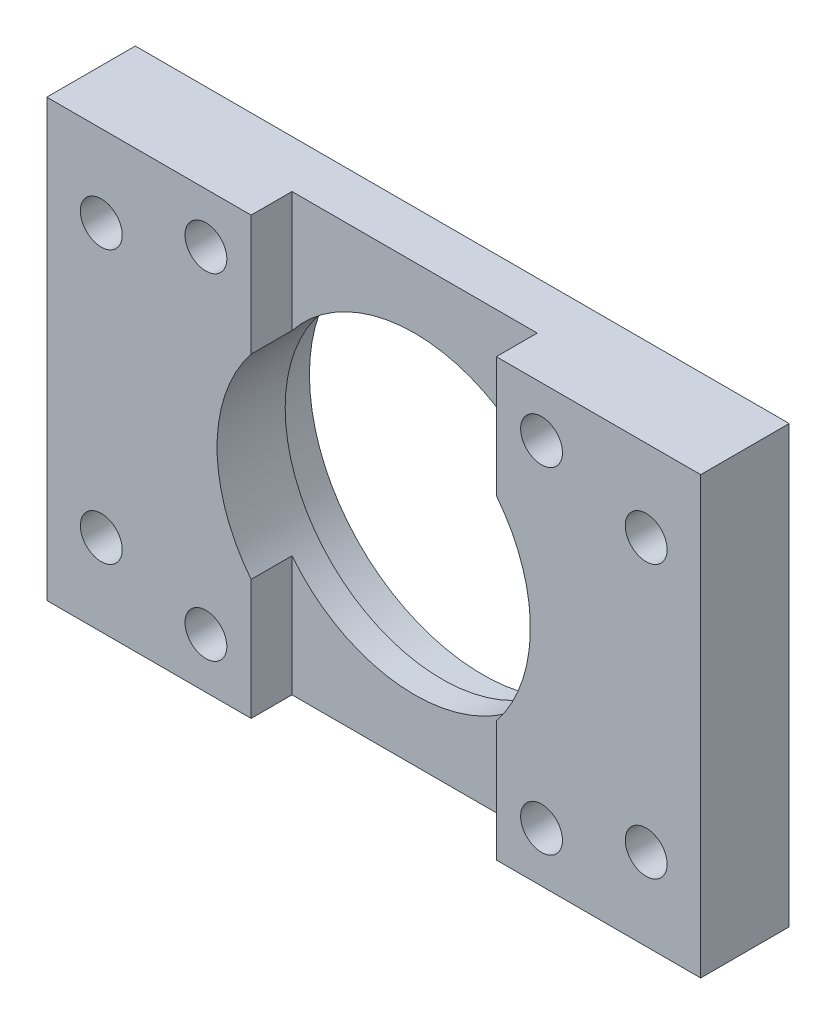
ISO-10303-21;
HEADER;
FILE_DESCRIPTION(('STEP AP214'),'2;1');
FILE_NAME('part.step','',(''),(''),'','','');
FILE_SCHEMA(('AUTOMOTIVE_DESIGN { 1 0 10303 214 1 1 1 1 }'));
ENDSEC;
DATA;
#1=APPLICATION_CONTEXT('core data for automotive mechanical design processes');
#2=APPLICATION_PROTOCOL_DEFINITION('international standard','automotive_design',2000,#1);
#3=PRODUCT_CONTEXT('',#1,'mechanical');
#4=PRODUCT('Part','Part','',(#3));
#5=PRODUCT_RELATED_PRODUCT_CATEGORY('part','',(#4));
#6=PRODUCT_DEFINITION_FORMATION('','',#4);
#7=PRODUCT_DEFINITION_CONTEXT('part definition',#1,'design');
#8=PRODUCT_DEFINITION('design','',#6,#7);
#9=PRODUCT_DEFINITION_SHAPE('','',#8);
#10=(LENGTH_UNIT() NAMED_UNIT(*) SI_UNIT(.MILLI.,.METRE.));
#11=(NAMED_UNIT(*) PLANE_ANGLE_UNIT() SI_UNIT($,.RADIAN.));
#12=(NAMED_UNIT(*) SI_UNIT($,.STERADIAN.) SOLID_ANGLE_UNIT());
#13=UNCERTAINTY_MEASURE_WITH_UNIT(LENGTH_MEASURE(1.E-05),#10,'distance_accuracy_value','');
#14=(GEOMETRIC_REPRESENTATION_CONTEXT(3) GLOBAL_UNCERTAINTY_ASSIGNED_CONTEXT((#13)) GLOBAL_UNIT_ASSIGNED_CONTEXT((#10,
#11,#12)) REPRESENTATION_CONTEXT('',''));
#15=CARTESIAN_POINT('',(0.,0.,0.));
#16=DIRECTION('',(0.,0.,1.));
#17=DIRECTION('',(1.,0.,0.));
#18=AXIS2_PLACEMENT_3D('',#15,#16,#17);
#19=CARTESIAN_POINT('',(0.,0.,0.));
#20=DIRECTION('',(0.,0.,1.));
#21=DIRECTION('',(1.,0.,0.));
#22=AXIS2_PLACEMENT_3D('',#19,#20,#21);
#23=CYLINDRICAL_SURFACE('',#22,9.128125);
#24=CARTESIAN_POINT('',(0.,0.,3.96875));
#25=DIRECTION('',(0.,0.,-1.));
#26=DIRECTION('',(-1.,0.,0.));
#27=AXIS2_PLACEMENT_3D('',#24,#25,#26);
#28=CIRCLE('',#27,9.128125);
#29=CARTESIAN_POINT('',(7.14375,5.6823852344878,3.96875));
#30=VERTEX_POINT('',#29);
#31=CARTESIAN_POINT('',(-7.14375,5.6823852344878,3.96875));
#32=VERTEX_POINT('',#31);
#33=EDGE_CURVE('E49',#30,#32,#28,.F.);
#34=ORIENTED_EDGE('',*,*,#33,.T.);
#35=DIRECTION('',(0.,0.,1.));
#36=VECTOR('',#35,1.);
#37=CARTESIAN_POINT('',(-7.14375,5.6823852344878,0.));
#38=LINE('',#37,#36);
#39=CARTESIAN_POINT('',(-7.14375,5.6823852344878,6.35));
#40=VERTEX_POINT('',#39);
#41=EDGE_CURVE('E12',#32,#40,#38,.T.);
#42=ORIENTED_EDGE('',*,*,#41,.T.);
#43=CARTESIAN_POINT('',(0.,0.,6.35));
#44=DIRECTION('',(0.,0.,1.));
#45=DIRECTION('',(1.,0.,0.));
#46=AXIS2_PLACEMENT_3D('',#43,#44,#45);
#47=CIRCLE('',#46,9.128125);
#48=CARTESIAN_POINT('',(-7.14375,-5.6823852344878,6.35));
#49=VERTEX_POINT('',#48);
#50=EDGE_CURVE('E202',#40,#49,#47,.T.);
#51=ORIENTED_EDGE('',*,*,#50,.T.);
#52=DIRECTION('',(0.,0.,1.));
#53=VECTOR('',#52,1.);
#54=CARTESIAN_POINT('',(-7.14375,-5.6823852344878,0.));
#55=LINE('',#54,#53);
#56=CARTESIAN_POINT('',(-7.14375,-5.6823852344878,3.96875));
#57=VERTEX_POINT('',#56);
#58=EDGE_CURVE('E164',#49,#57,#55,.F.);
#59=ORIENTED_EDGE('',*,*,#58,.T.);
#60=CARTESIAN_POINT('',(7.14375,-5.6823852344878,3.96875));
#61=VERTEX_POINT('',#60);
#62=EDGE_CURVE('E156',#57,#61,#28,.F.);
#63=ORIENTED_EDGE('',*,*,#62,.T.);
#64=DIRECTION('',(0.,0.,1.));
#65=VECTOR('',#64,1.);
#66=CARTESIAN_POINT('',(7.14375,-5.6823852344878,0.));
#67=LINE('',#66,#65);
#68=CARTESIAN_POINT('',(7.14375,-5.6823852344878,6.35));
#69=VERTEX_POINT('',#68);
#70=EDGE_CURVE('E152',#61,#69,#67,.T.);
#71=ORIENTED_EDGE('',*,*,#70,.T.);
#72=CARTESIAN_POINT('',(7.14375,5.6823852344878,6.35));
#73=VERTEX_POINT('',#72);
#74=EDGE_CURVE('E199',#69,#73,#47,.T.);
#75=ORIENTED_EDGE('',*,*,#74,.T.);
#76=DIRECTION('',(0.,0.,1.));
#77=VECTOR('',#76,1.);
#78=CARTESIAN_POINT('',(7.14375,5.6823852344878,0.));
#79=LINE('',#78,#77);
#80=EDGE_CURVE('E167',#73,#30,#79,.F.);
#81=ORIENTED_EDGE('',*,*,#80,.T.);
#82=EDGE_LOOP('',(#34,#42,#51,#59,#63,#71,#75,#81));
#83=FACE_BOUND('',#82,.T.);
#84=CARTESIAN_POINT('',(0.,0.,2.38125));
#85=DIRECTION('',(0.,0.,-1.));
#86=DIRECTION('',(-1.,0.,0.));
#87=AXIS2_PLACEMENT_3D('',#84,#85,#86);
#88=CIRCLE('',#87,9.128125);
#89=CARTESIAN_POINT('',(-9.128125,0.,2.38125));
#90=VERTEX_POINT('',#89);
#91=EDGE_CURVE('E44',#90,#90,#88,.F.);
#92=ORIENTED_EDGE('',*,*,#91,.F.);
#93=EDGE_LOOP('',(#92));
#94=FACE_BOUND('',#93,.T.);
#95=ADVANCED_FACE('F40',(#83,#94),#23,.F.);
#96=CARTESIAN_POINT('',(-19.05,12.7,6.35));
#97=DIRECTION('',(1.,0.,0.));
#98=DIRECTION('',(0.,0.,-1.));
#99=AXIS2_PLACEMENT_3D('',#96,#97,#98);
#100=PLANE('',#99);
#101=DIRECTION('',(0.,1.,0.));
#102=VECTOR('',#101,1.);
#103=CARTESIAN_POINT('',(-19.05,0.,1.190625));
#104=LINE('',#103,#102);
#105=CARTESIAN_POINT('',(-19.05,-12.7,1.190625));
#106=VERTEX_POINT('',#105);
#107=CARTESIAN_POINT('',(-19.05,12.7,1.190625));
#108=VERTEX_POINT('',#107);
#109=EDGE_CURVE('E56',#106,#108,#104,.T.);
#110=ORIENTED_EDGE('',*,*,#109,.F.);
#111=DIRECTION('',(0.,0.,-1.));
#112=VECTOR('',#111,1.);
#113=CARTESIAN_POINT('',(-19.05,-12.7,6.35));
#114=LINE('',#113,#112);
#115=CARTESIAN_POINT('',(-19.05,-12.7,6.35));
#116=VERTEX_POINT('',#115);
#117=EDGE_CURVE('E142',#116,#106,#114,.T.);
#118=ORIENTED_EDGE('',*,*,#117,.F.);
#119=DIRECTION('',(0.,-1.,0.));
#120=VECTOR('',#119,1.);
#121=CARTESIAN_POINT('',(-19.05,12.7,6.35));
#122=LINE('',#121,#120);
#123=CARTESIAN_POINT('',(-19.05,12.7,6.35));
#124=VERTEX_POINT('',#123);
#125=EDGE_CURVE('E203',#124,#116,#122,.T.);
#126=ORIENTED_EDGE('',*,*,#125,.F.);
#127=DIRECTION('',(0.,0.,-1.));
#128=VECTOR('',#127,1.);
#129=CARTESIAN_POINT('',(-19.05,12.7,6.35));
#130=LINE('',#129,#128);
#131=EDGE_CURVE('E144',#124,#108,#130,.T.);
#132=ORIENTED_EDGE('',*,*,#131,.T.);
#133=EDGE_LOOP('',(#110,#118,#126,#132));
#134=FACE_BOUND('',#133,.T.);
#135=ADVANCED_FACE('F42',(#134),#100,.F.);
#136=CARTESIAN_POINT('',(19.05,-12.7,6.35));
#137=DIRECTION('',(0.,1.,0.));
#138=DIRECTION('',(-1.,0.,0.));
#139=AXIS2_PLACEMENT_3D('',#136,#137,#138);
#140=PLANE('',#139);
#141=DIRECTION('',(-1.,0.,0.));
#142=VECTOR('',#141,1.);
#143=CARTESIAN_POINT('',(0.,-12.7,1.190625));
#144=LINE('',#143,#142);
#145=CARTESIAN_POINT('',(19.05,-12.7,1.190625));
#146=VERTEX_POINT('',#145);
#147=EDGE_CURVE('E128',#146,#106,#144,.T.);
#148=ORIENTED_EDGE('',*,*,#147,.F.);
#149=DIRECTION('',(0.,0.,-1.));
#150=VECTOR('',#149,1.);
#151=CARTESIAN_POINT('',(19.05,-12.7,6.35));
#152=LINE('',#151,#150);
#153=CARTESIAN_POINT('',(19.05,-12.7,6.35));
#154=VERTEX_POINT('',#153);
#155=EDGE_CURVE('E153',#154,#146,#152,.T.);
#156=ORIENTED_EDGE('',*,*,#155,.F.);
#157=DIRECTION('',(1.,0.,0.));
#158=VECTOR('',#157,1.);
#159=CARTESIAN_POINT('',(19.05,-12.7,6.35));
#160=LINE('',#159,#158);
#161=CARTESIAN_POINT('',(7.14375,-12.7,6.35));
#162=VERTEX_POINT('',#161);
#163=EDGE_CURVE('E205',#162,#154,#160,.T.);
#164=ORIENTED_EDGE('',*,*,#163,.F.);
#165=DIRECTION('',(0.,0.,1.));
#166=VECTOR('',#165,1.);
#167=CARTESIAN_POINT('',(7.14375,-12.7,-29.1426261042137));
#168=LINE('',#167,#166);
#169=CARTESIAN_POINT('',(7.14375,-12.7,3.96875));
#170=VERTEX_POINT('',#169);
#171=EDGE_CURVE('E193',#170,#162,#168,.T.);
#172=ORIENTED_EDGE('',*,*,#171,.F.);
#173=DIRECTION('',(1.,0.,0.));
#174=VECTOR('',#173,1.);
#175=CARTESIAN_POINT('',(-7.14375,-12.7,3.96875));
#176=LINE('',#175,#174);
#177=CARTESIAN_POINT('',(-7.14375,-12.7,3.96875));
#178=VERTEX_POINT('',#177);
#179=EDGE_CURVE('E187',#178,#170,#176,.T.);
#180=ORIENTED_EDGE('',*,*,#179,.F.);
#181=DIRECTION('',(0.,0.,1.));
#182=VECTOR('',#181,1.);
#183=CARTESIAN_POINT('',(-7.14375,-12.7,-29.1426261042137));
#184=LINE('',#183,#182);
#185=CARTESIAN_POINT('',(-7.14375,-12.7,6.35));
#186=VERTEX_POINT('',#185);
#187=EDGE_CURVE('E184',#178,#186,#184,.T.);
#188=ORIENTED_EDGE('',*,*,#187,.T.);
#189=EDGE_CURVE('E150',#116,#186,#160,.T.);
#190=ORIENTED_EDGE('',*,*,#189,.F.);
#191=ORIENTED_EDGE('',*,*,#117,.T.);
#192=EDGE_LOOP('',(#148,#156,#164,#172,#180,#188,#190,#191));
#193=FACE_BOUND('',#192,.T.);
#194=ADVANCED_FACE('F147',(#193),#140,.F.);
#195=CARTESIAN_POINT('',(19.05,12.7,6.35));
#196=DIRECTION('',(-1.,0.,0.));
#197=DIRECTION('',(0.,-1.,0.));
#198=AXIS2_PLACEMENT_3D('',#195,#196,#197);
#199=PLANE('',#198);
#200=DIRECTION('',(0.,-1.,0.));
#201=VECTOR('',#200,1.);
#202=CARTESIAN_POINT('',(19.05,0.,1.190625));
#203=LINE('',#202,#201);
#204=CARTESIAN_POINT('',(19.05,12.7,1.190625));
#205=VERTEX_POINT('',#204);
#206=EDGE_CURVE('E131',#205,#146,#203,.T.);
#207=ORIENTED_EDGE('',*,*,#206,.F.);
#208=DIRECTION('',(0.,0.,-1.));
#209=VECTOR('',#208,1.);
#210=CARTESIAN_POINT('',(19.05,12.7,6.35));
#211=LINE('',#210,#209);
#212=CARTESIAN_POINT('',(19.05,12.7,6.35));
#213=VERTEX_POINT('',#212);
#214=EDGE_CURVE('E158',#213,#205,#211,.T.);
#215=ORIENTED_EDGE('',*,*,#214,.F.);
#216=DIRECTION('',(0.,1.,0.));
#217=VECTOR('',#216,1.);
#218=CARTESIAN_POINT('',(19.05,12.7,6.35));
#219=LINE('',#218,#217);
#220=EDGE_CURVE('E207',#154,#213,#219,.T.);
#221=ORIENTED_EDGE('',*,*,#220,.F.);
#222=ORIENTED_EDGE('',*,*,#155,.T.);
#223=EDGE_LOOP('',(#207,#215,#221,#222));
#224=FACE_BOUND('',#223,.T.);
#225=ADVANCED_FACE('F220',(#224),#199,.F.);
#226=CARTESIAN_POINT('',(19.05,12.7,6.35));
#227=DIRECTION('',(0.,-1.,0.));
#228=DIRECTION('',(1.,0.,0.));
#229=AXIS2_PLACEMENT_3D('',#226,#227,#228);
#230=PLANE('',#229);
#231=DIRECTION('',(1.,0.,0.));
#232=VECTOR('',#231,1.);
#233=CARTESIAN_POINT('',(0.,12.7,1.190625));
#234=LINE('',#233,#232);
#235=EDGE_CURVE('E145',#108,#205,#234,.T.);
#236=ORIENTED_EDGE('',*,*,#235,.F.);
#237=ORIENTED_EDGE('',*,*,#131,.F.);
#238=DIRECTION('',(-1.,0.,0.));
#239=VECTOR('',#238,1.);
#240=CARTESIAN_POINT('',(19.05,12.7,6.35));
#241=LINE('',#240,#239);
#242=CARTESIAN_POINT('',(-7.14375,12.7,6.35));
#243=VERTEX_POINT('',#242);
#244=EDGE_CURVE('E209',#243,#124,#241,.T.);
#245=ORIENTED_EDGE('',*,*,#244,.F.);
#246=DIRECTION('',(0.,0.,1.));
#247=VECTOR('',#246,1.);
#248=CARTESIAN_POINT('',(-7.14375,12.7,-29.1426261042137));
#249=LINE('',#248,#247);
#250=CARTESIAN_POINT('',(-7.14375,12.7,3.96875));
#251=VERTEX_POINT('',#250);
#252=EDGE_CURVE('E189',#251,#243,#249,.T.);
#253=ORIENTED_EDGE('',*,*,#252,.F.);
#254=DIRECTION('',(-1.,0.,0.));
#255=VECTOR('',#254,1.);
#256=CARTESIAN_POINT('',(-7.14375,12.7,3.96875));
#257=LINE('',#256,#255);
#258=CARTESIAN_POINT('',(7.14375,12.7,3.96875));
#259=VERTEX_POINT('',#258);
#260=EDGE_CURVE('E181',#259,#251,#257,.T.);
#261=ORIENTED_EDGE('',*,*,#260,.F.);
#262=DIRECTION('',(0.,0.,1.));
#263=VECTOR('',#262,1.);
#264=CARTESIAN_POINT('',(7.14375,12.7,-29.1426261042137));
#265=LINE('',#264,#263);
#266=CARTESIAN_POINT('',(7.14375,12.7,6.35));
#267=VERTEX_POINT('',#266);
#268=EDGE_CURVE('E196',#259,#267,#265,.T.);
#269=ORIENTED_EDGE('',*,*,#268,.T.);
#270=EDGE_CURVE('E210',#213,#267,#241,.T.);
#271=ORIENTED_EDGE('',*,*,#270,.F.);
#272=ORIENTED_EDGE('',*,*,#214,.T.);
#273=EDGE_LOOP('',(#236,#237,#245,#253,#261,#269,#271,#272));
#274=FACE_BOUND('',#273,.T.);
#275=ADVANCED_FACE('F217',(#274),#230,.F.);
#276=CARTESIAN_POINT('',(0.,0.,0.));
#277=DIRECTION('',(0.,0.,-1.));
#278=DIRECTION('',(-1.,0.,0.));
#279=AXIS2_PLACEMENT_3D('',#276,#277,#278);
#280=PLANE('',#279);
#281=CARTESIAN_POINT('',(0.,0.,0.));
#282=DIRECTION('',(0.,0.,-1.));
#283=DIRECTION('',(-1.,0.,0.));
#284=AXIS2_PLACEMENT_3D('',#281,#282,#283);
#285=CIRCLE('',#284,10.0965);
#286=CARTESIAN_POINT('',(-10.0965,0.,0.));
#287=VERTEX_POINT('',#286);
#288=EDGE_CURVE('E623',#287,#287,#285,.T.);
#289=ORIENTED_EDGE('',*,*,#288,.F.);
#290=EDGE_LOOP('',(#289));
#291=FACE_BOUND('',#290,.T.);
#292=CARTESIAN_POINT('',(0.,0.,0.));
#293=DIRECTION('',(0.,0.,-1.));
#294=DIRECTION('',(-1.,0.,0.));
#295=AXIS2_PLACEMENT_3D('',#292,#293,#294);
#296=CIRCLE('',#295,11.3665);
#297=CARTESIAN_POINT('',(-11.3665,0.,0.));
#298=VERTEX_POINT('',#297);
#299=EDGE_CURVE('E227',#298,#298,#296,.T.);
#300=ORIENTED_EDGE('',*,*,#299,.T.);
#301=EDGE_LOOP('',(#300));
#302=FACE_BOUND('',#301,.T.);
#303=ADVANCED_FACE('F273',(#291,#302),#280,.T.);
#304=CARTESIAN_POINT('',(0.,0.,6.35));
#305=DIRECTION('',(0.,0.,-1.));
#306=DIRECTION('',(-1.,0.,0.));
#307=AXIS2_PLACEMENT_3D('',#304,#305,#306);
#308=PLANE('',#307);
#309=CARTESIAN_POINT('',(-15.875,-7.9375,6.35));
#310=DIRECTION('',(0.,0.,-1.));
#311=DIRECTION('',(-1.,0.,0.));
#312=AXIS2_PLACEMENT_3D('',#309,#310,#311);
#313=CIRCLE('',#312,1.2192);
#314=CARTESIAN_POINT('',(-17.0942,-7.9375,6.35));
#315=VERTEX_POINT('',#314);
#316=EDGE_CURVE('E584',#315,#315,#313,.T.);
#317=ORIENTED_EDGE('',*,*,#316,.T.);
#318=EDGE_LOOP('',(#317));
#319=FACE_BOUND('',#318,.T.);
#320=CARTESIAN_POINT('',(-15.875,7.9375,6.35));
#321=DIRECTION('',(0.,0.,-1.));
#322=DIRECTION('',(-1.,0.,0.));
#323=AXIS2_PLACEMENT_3D('',#320,#321,#322);
#324=CIRCLE('',#323,1.2192);
#325=CARTESIAN_POINT('',(-17.0942,7.9375,6.35));
#326=VERTEX_POINT('',#325);
#327=EDGE_CURVE('E596',#326,#326,#324,.T.);
#328=ORIENTED_EDGE('',*,*,#327,.T.);
#329=EDGE_LOOP('',(#328));
#330=FACE_BOUND('',#329,.T.);
#331=CARTESIAN_POINT('',(-9.779,9.779,6.35));
#332=DIRECTION('',(0.,0.,-1.));
#333=DIRECTION('',(-1.,0.,0.));
#334=AXIS2_PLACEMENT_3D('',#331,#332,#333);
#335=CIRCLE('',#334,1.2192);
#336=CARTESIAN_POINT('',(-10.9982,9.779,6.35));
#337=VERTEX_POINT('',#336);
#338=EDGE_CURVE('E608',#337,#337,#335,.T.);
#339=ORIENTED_EDGE('',*,*,#338,.T.);
#340=EDGE_LOOP('',(#339));
#341=FACE_BOUND('',#340,.T.);
#342=CARTESIAN_POINT('',(-9.779,-9.779,6.35));
#343=DIRECTION('',(0.,0.,-1.));
#344=DIRECTION('',(-1.,0.,0.));
#345=AXIS2_PLACEMENT_3D('',#342,#343,#344);
#346=CIRCLE('',#345,1.2192);
#347=CARTESIAN_POINT('',(-10.9982,-9.779,6.35));
#348=VERTEX_POINT('',#347);
#349=EDGE_CURVE('E614',#348,#348,#346,.T.);
#350=ORIENTED_EDGE('',*,*,#349,.T.);
#351=EDGE_LOOP('',(#350));
#352=FACE_BOUND('',#351,.T.);
#353=ORIENTED_EDGE('',*,*,#189,.T.);
#354=DIRECTION('',(0.,-1.,0.));
#355=VECTOR('',#354,1.);
#356=CARTESIAN_POINT('',(-7.14375,-12.7,6.35));
#357=LINE('',#356,#355);
#358=EDGE_CURVE('E231',#49,#186,#357,.T.);
#359=ORIENTED_EDGE('',*,*,#358,.F.);
#360=ORIENTED_EDGE('',*,*,#50,.F.);
#361=EDGE_CURVE('E230',#243,#40,#357,.T.);
#362=ORIENTED_EDGE('',*,*,#361,.F.);
#363=ORIENTED_EDGE('',*,*,#244,.T.);
#364=ORIENTED_EDGE('',*,*,#125,.T.);
#365=EDGE_LOOP('',(#353,#359,#360,#362,#363,#364));
#366=FACE_BOUND('',#365,.T.);
#367=ADVANCED_FACE('F247',(#319,#330,#341,#352,#366),#308,.F.);
#368=CARTESIAN_POINT('',(15.875,7.9375,6.35));
#369=DIRECTION('',(0.,0.,-1.));
#370=DIRECTION('',(-1.,0.,0.));
#371=AXIS2_PLACEMENT_3D('',#368,#369,#370);
#372=CIRCLE('',#371,1.2192);
#373=CARTESIAN_POINT('',(14.6558,7.9375,6.35));
#374=VERTEX_POINT('',#373);
#375=EDGE_CURVE('E560',#374,#374,#372,.T.);
#376=ORIENTED_EDGE('',*,*,#375,.T.);
#377=EDGE_LOOP('',(#376));
#378=FACE_BOUND('',#377,.T.);
#379=CARTESIAN_POINT('',(15.875,-7.9375,6.35));
#380=DIRECTION('',(0.,0.,-1.));
#381=DIRECTION('',(-1.,0.,0.));
#382=AXIS2_PLACEMENT_3D('',#379,#380,#381);
#383=CIRCLE('',#382,1.2192);
#384=CARTESIAN_POINT('',(14.6558,-7.9375,6.35));
#385=VERTEX_POINT('',#384);
#386=EDGE_CURVE('E572',#385,#385,#383,.T.);
#387=ORIENTED_EDGE('',*,*,#386,.T.);
#388=EDGE_LOOP('',(#387));
#389=FACE_BOUND('',#388,.T.);
#390=CARTESIAN_POINT('',(9.779,9.779,6.35));
#391=DIRECTION('',(0.,0.,-1.));
#392=DIRECTION('',(-1.,0.,0.));
#393=AXIS2_PLACEMENT_3D('',#390,#391,#392);
#394=CIRCLE('',#393,1.2192);
#395=CARTESIAN_POINT('',(8.5598,9.779,6.35));
#396=VERTEX_POINT('',#395);
#397=EDGE_CURVE('E602',#396,#396,#394,.T.);
#398=ORIENTED_EDGE('',*,*,#397,.T.);
#399=EDGE_LOOP('',(#398));
#400=FACE_BOUND('',#399,.T.);
#401=CARTESIAN_POINT('',(9.779,-9.779,6.35));
#402=DIRECTION('',(0.,0.,-1.));
#403=DIRECTION('',(-1.,0.,0.));
#404=AXIS2_PLACEMENT_3D('',#401,#402,#403);
#405=CIRCLE('',#404,1.2192);
#406=CARTESIAN_POINT('',(8.5598,-9.779,6.35));
#407=VERTEX_POINT('',#406);
#408=EDGE_CURVE('E620',#407,#407,#405,.T.);
#409=ORIENTED_EDGE('',*,*,#408,.T.);
#410=EDGE_LOOP('',(#409));
#411=FACE_BOUND('',#410,.T.);
#412=ORIENTED_EDGE('',*,*,#270,.T.);
#413=DIRECTION('',(0.,1.,0.));
#414=VECTOR('',#413,1.);
#415=CARTESIAN_POINT('',(7.14375,-12.7,6.35));
#416=LINE('',#415,#414);
#417=EDGE_CURVE('E221',#73,#267,#416,.T.);
#418=ORIENTED_EDGE('',*,*,#417,.F.);
#419=ORIENTED_EDGE('',*,*,#74,.F.);
#420=EDGE_CURVE('E223',#162,#69,#416,.T.);
#421=ORIENTED_EDGE('',*,*,#420,.F.);
#422=ORIENTED_EDGE('',*,*,#163,.T.);
#423=ORIENTED_EDGE('',*,*,#220,.T.);
#424=EDGE_LOOP('',(#412,#418,#419,#421,#422,#423));
#425=FACE_BOUND('',#424,.T.);
#426=ADVANCED_FACE('F269',(#378,#389,#400,#411,#425),#308,.F.);
#427=CARTESIAN_POINT('',(7.14375,-12.7,-29.1426261042137));
#428=DIRECTION('',(1.,0.,0.));
#429=DIRECTION('',(0.,0.,-1.));
#430=AXIS2_PLACEMENT_3D('',#427,#428,#429);
#431=PLANE('',#430);
#432=DIRECTION('',(0.,1.,0.));
#433=VECTOR('',#432,1.);
#434=CARTESIAN_POINT('',(7.14375,-12.7,3.96875));
#435=LINE('',#434,#433);
#436=EDGE_CURVE('E200',#170,#61,#435,.T.);
#437=ORIENTED_EDGE('',*,*,#436,.F.);
#438=ORIENTED_EDGE('',*,*,#171,.T.);
#439=ORIENTED_EDGE('',*,*,#420,.T.);
#440=ORIENTED_EDGE('',*,*,#70,.F.);
#441=EDGE_LOOP('',(#437,#438,#439,#440));
#442=FACE_BOUND('',#441,.T.);
#443=ADVANCED_FACE('F260',(#442),#431,.F.);
#444=CARTESIAN_POINT('',(-7.14375,-12.7,-29.1426261042137));
#445=DIRECTION('',(-1.,0.,0.));
#446=DIRECTION('',(0.,0.,1.));
#447=AXIS2_PLACEMENT_3D('',#444,#445,#446);
#448=PLANE('',#447);
#449=ORIENTED_EDGE('',*,*,#358,.T.);
#450=ORIENTED_EDGE('',*,*,#187,.F.);
#451=DIRECTION('',(0.,-1.,0.));
#452=VECTOR('',#451,1.);
#453=CARTESIAN_POINT('',(-7.14375,-12.7,3.96875));
#454=LINE('',#453,#452);
#455=EDGE_CURVE('E185',#57,#178,#454,.T.);
#456=ORIENTED_EDGE('',*,*,#455,.F.);
#457=ORIENTED_EDGE('',*,*,#58,.F.);
#458=EDGE_LOOP('',(#449,#450,#456,#457));
#459=FACE_BOUND('',#458,.T.);
#460=ADVANCED_FACE('F244',(#459),#448,.F.);
#461=CARTESIAN_POINT('',(0.,0.,3.96875));
#462=DIRECTION('',(0.,0.,-1.));
#463=DIRECTION('',(-1.,0.,0.));
#464=AXIS2_PLACEMENT_3D('',#461,#462,#463);
#465=PLANE('',#464);
#466=ORIENTED_EDGE('',*,*,#455,.T.);
#467=ORIENTED_EDGE('',*,*,#179,.T.);
#468=ORIENTED_EDGE('',*,*,#436,.T.);
#469=ORIENTED_EDGE('',*,*,#62,.F.);
#470=EDGE_LOOP('',(#466,#467,#468,#469));
#471=FACE_BOUND('',#470,.T.);
#472=ADVANCED_FACE('F236',(#471),#465,.F.);
#473=EDGE_CURVE('E64',#30,#259,#435,.T.);
#474=ORIENTED_EDGE('',*,*,#473,.T.);
#475=ORIENTED_EDGE('',*,*,#260,.T.);
#476=EDGE_CURVE('E179',#251,#32,#454,.T.);
#477=ORIENTED_EDGE('',*,*,#476,.T.);
#478=ORIENTED_EDGE('',*,*,#33,.F.);
#479=EDGE_LOOP('',(#474,#475,#477,#478));
#480=FACE_BOUND('',#479,.T.);
#481=ADVANCED_FACE('F177',(#480),#465,.F.);
#482=ORIENTED_EDGE('',*,*,#476,.F.);
#483=ORIENTED_EDGE('',*,*,#252,.T.);
#484=ORIENTED_EDGE('',*,*,#361,.T.);
#485=ORIENTED_EDGE('',*,*,#41,.F.);
#486=EDGE_LOOP('',(#482,#483,#484,#485));
#487=FACE_BOUND('',#486,.T.);
#488=ADVANCED_FACE('F250',(#487),#448,.F.);
#489=ORIENTED_EDGE('',*,*,#417,.T.);
#490=ORIENTED_EDGE('',*,*,#268,.F.);
#491=ORIENTED_EDGE('',*,*,#473,.F.);
#492=ORIENTED_EDGE('',*,*,#80,.F.);
#493=EDGE_LOOP('',(#489,#490,#491,#492));
#494=FACE_BOUND('',#493,.T.);
#495=ADVANCED_FACE('F252',(#494),#431,.F.);
#496=CARTESIAN_POINT('',(0.,0.,1.190625));
#497=DIRECTION('',(0.,0.,-1.));
#498=DIRECTION('',(-1.,0.,0.));
#499=AXIS2_PLACEMENT_3D('',#496,#497,#498);
#500=CYLINDRICAL_SURFACE('',#499,11.3665);
#501=CARTESIAN_POINT('',(0.,0.,1.190625));
#502=DIRECTION('',(0.,0.,-1.));
#503=DIRECTION('',(-1.,0.,0.));
#504=AXIS2_PLACEMENT_3D('',#501,#502,#503);
#505=CIRCLE('',#504,11.3665);
#506=CARTESIAN_POINT('',(-11.3665,0.,1.190625));
#507=VERTEX_POINT('',#506);
#508=EDGE_CURVE('E136',#507,#507,#505,.T.);
#509=CARTESIAN_POINT('',(-11.3665,0.,1.190625));
#510=CARTESIAN_POINT('',(-11.3665,0.,1.17822265625));
#511=CARTESIAN_POINT('',(-11.3665,0.,1.1658203125));
#512=CARTESIAN_POINT('',(-11.3665,0.,1.141015625));
#513=CARTESIAN_POINT('',(-11.3665,0.,1.12861328125));
#514=CARTESIAN_POINT('',(-11.3665,0.,1.10380859375));
#515=CARTESIAN_POINT('',(-11.3665,0.,1.09140625));
#516=CARTESIAN_POINT('',(-11.3665,0.,1.0666015625));
#517=CARTESIAN_POINT('',(-11.3665,0.,1.05419921875));
#518=CARTESIAN_POINT('',(-11.3665,0.,1.02939453125));
#519=CARTESIAN_POINT('',(-11.3665,0.,1.0169921875));
#520=CARTESIAN_POINT('',(-11.3665,0.,0.9921875));
#521=CARTESIAN_POINT('',(-11.3665,0.,0.97978515625));
#522=CARTESIAN_POINT('',(-11.3665,0.,0.95498046875));
#523=CARTESIAN_POINT('',(-11.3665,0.,0.942578125));
#524=CARTESIAN_POINT('',(-11.3665,0.,0.9177734375));
#525=CARTESIAN_POINT('',(-11.3665,0.,0.90537109375));
#526=CARTESIAN_POINT('',(-11.3665,0.,0.88056640625));
#527=CARTESIAN_POINT('',(-11.3665,0.,0.8681640625));
#528=CARTESIAN_POINT('',(-11.3665,0.,0.843359375));
#529=CARTESIAN_POINT('',(-11.3665,0.,0.83095703125));
#530=CARTESIAN_POINT('',(-11.3665,0.,0.80615234375));
#531=CARTESIAN_POINT('',(-11.3665,0.,0.79375));
#532=CARTESIAN_POINT('',(-11.3665,0.,0.7689453125));
#533=CARTESIAN_POINT('',(-11.3665,0.,0.75654296875));
#534=CARTESIAN_POINT('',(-11.3665,0.,0.73173828125));
#535=CARTESIAN_POINT('',(-11.3665,0.,0.7193359375));
#536=CARTESIAN_POINT('',(-11.3665,0.,0.69453125));
#537=CARTESIAN_POINT('',(-11.3665,0.,0.68212890625));
#538=CARTESIAN_POINT('',(-11.3665,0.,0.65732421875));
#539=CARTESIAN_POINT('',(-11.3665,0.,0.644921875));
#540=CARTESIAN_POINT('',(-11.3665,0.,0.6201171875));
#541=CARTESIAN_POINT('',(-11.3665,0.,0.60771484375));
#542=CARTESIAN_POINT('',(-11.3665,0.,0.58291015625));
#543=CARTESIAN_POINT('',(-11.3665,0.,0.5705078125));
#544=CARTESIAN_POINT('',(-11.3665,0.,0.545703125));
#545=CARTESIAN_POINT('',(-11.3665,0.,0.53330078125));
#546=CARTESIAN_POINT('',(-11.3665,0.,0.50849609375));
#547=CARTESIAN_POINT('',(-11.3665,0.,0.49609375));
#548=CARTESIAN_POINT('',(-11.3665,0.,0.4712890625));
#549=CARTESIAN_POINT('',(-11.3665,0.,0.45888671875));
#550=CARTESIAN_POINT('',(-11.3665,0.,0.43408203125));
#551=CARTESIAN_POINT('',(-11.3665,0.,0.4216796875));
#552=CARTESIAN_POINT('',(-11.3665,0.,0.396875));
#553=CARTESIAN_POINT('',(-11.3665,0.,0.38447265625));
#554=CARTESIAN_POINT('',(-11.3665,0.,0.35966796875));
#555=CARTESIAN_POINT('',(-11.3665,0.,0.347265625));
#556=CARTESIAN_POINT('',(-11.3665,0.,0.3224609375));
#557=CARTESIAN_POINT('',(-11.3665,0.,0.31005859375));
#558=CARTESIAN_POINT('',(-11.3665,0.,0.28525390625));
#559=CARTESIAN_POINT('',(-11.3665,0.,0.2728515625));
#560=CARTESIAN_POINT('',(-11.3665,0.,0.248046875));
#561=CARTESIAN_POINT('',(-11.3665,0.,0.23564453125));
#562=CARTESIAN_POINT('',(-11.3665,0.,0.21083984375));
#563=CARTESIAN_POINT('',(-11.3665,0.,0.1984375));
#564=CARTESIAN_POINT('',(-11.3665,0.,0.1736328125));
#565=CARTESIAN_POINT('',(-11.3665,0.,0.16123046875));
#566=CARTESIAN_POINT('',(-11.3665,0.,0.13642578125));
#567=CARTESIAN_POINT('',(-11.3665,0.,0.1240234375));
#568=CARTESIAN_POINT('',(-11.3665,0.,0.0992187500000001));
#569=CARTESIAN_POINT('',(-11.3665,0.,0.08681640625));
#570=CARTESIAN_POINT('',(-11.3665,0.,0.06201171875));
#571=CARTESIAN_POINT('',(-11.3665,0.,0.049609375));
#572=CARTESIAN_POINT('',(-11.3665,0.,0.0248046875));
#573=CARTESIAN_POINT('',(-11.3665,0.,0.01240234375));
#574=CARTESIAN_POINT('',(-11.3665,0.,0.));
#575=B_SPLINE_CURVE_WITH_KNOTS('',3,(#509,#510,#511,#512,#513,#514,#515,#516,#517,#518,#519,
#520,#521,#522,#523,#524,#525,#526,#527,#528,#529,#530,#531,#532,#533,#534,#535,#536,#537,#538,
#539,#540,#541,#542,#543,#544,#545,#546,#547,#548,#549,#550,#551,#552,#553,#554,#555,#556,#557,
#558,#559,#560,#561,#562,#563,#564,#565,#566,#567,#568,#569,#570,#571,#572,#573,#574),
.UNSPECIFIED.,.F.,.F.,(4,2,2,2,2,2,2,2,2,2,2,2,2,2,2,2,2,2,2,2,2,2,2,2,2,2,2,2,2,2,2,2,4),(0.,
0.03720703125,0.0744140625,0.11162109375,0.148828125,0.18603515625,0.2232421875,0.26044921875,
0.29765625,0.33486328125,0.3720703125,0.40927734375,0.446484375,0.48369140625,0.5208984375,
0.55810546875,0.5953125,0.63251953125,0.6697265625,0.70693359375,0.744140625,0.78134765625,
0.8185546875,0.85576171875,0.89296875,0.93017578125,0.9673828125,1.00458984375,1.041796875,
1.07900390625,1.1162109375,1.15341796875,1.190625),.UNSPECIFIED.);
#576=EDGE_CURVE('BSEAM258',#507,#298,#575,.T.);
#577=ORIENTED_EDGE('',*,*,#508,.T.);
#578=ORIENTED_EDGE('',*,*,#299,.F.);
#579=ORIENTED_EDGE('',*,*,#576,.T.);
#580=ORIENTED_EDGE('',*,*,#576,.F.);
#581=EDGE_LOOP('',(#577,#579,#578,#580));
#582=FACE_BOUND('',#581,.T.);
#583=ADVANCED_FACE('F258',(#582),#500,.T.);
#584=CARTESIAN_POINT('',(0.,0.,1.190625));
#585=DIRECTION('',(0.,0.,-1.));
#586=DIRECTION('',(-1.,0.,0.));
#587=AXIS2_PLACEMENT_3D('',#584,#585,#586);
#588=PLANE('',#587);
#589=CARTESIAN_POINT('',(15.875,7.9375,1.190625));
#590=DIRECTION('',(0.,0.,-1.));
#591=DIRECTION('',(-1.,0.,0.));
#592=AXIS2_PLACEMENT_3D('',#589,#590,#591);
#593=CIRCLE('',#592,2.38125);
#594=CARTESIAN_POINT('',(13.49375,7.9375,1.190625));
#595=VERTEX_POINT('',#594);
#596=EDGE_CURVE('E553',#595,#595,#593,.T.);
#597=ORIENTED_EDGE('',*,*,#596,.F.);
#598=EDGE_LOOP('',(#597));
#599=FACE_BOUND('',#598,.T.);
#600=CARTESIAN_POINT('',(15.875,-7.9375,1.190625));
#601=DIRECTION('',(0.,0.,-1.));
#602=DIRECTION('',(-1.,0.,0.));
#603=AXIS2_PLACEMENT_3D('',#600,#601,#602);
#604=CIRCLE('',#603,2.38125);
#605=CARTESIAN_POINT('',(13.49375,-7.9375,1.190625));
#606=VERTEX_POINT('',#605);
#607=EDGE_CURVE('E563',#606,#606,#604,.T.);
#608=ORIENTED_EDGE('',*,*,#607,.F.);
#609=EDGE_LOOP('',(#608));
#610=FACE_BOUND('',#609,.T.);
#611=CARTESIAN_POINT('',(-15.875,-7.9375,1.190625));
#612=DIRECTION('',(0.,0.,-1.));
#613=DIRECTION('',(-1.,0.,0.));
#614=AXIS2_PLACEMENT_3D('',#611,#612,#613);
#615=CIRCLE('',#614,2.38125);
#616=CARTESIAN_POINT('',(-18.25625,-7.9375,1.190625));
#617=VERTEX_POINT('',#616);
#618=EDGE_CURVE('E575',#617,#617,#615,.T.);
#619=ORIENTED_EDGE('',*,*,#618,.F.);
#620=EDGE_LOOP('',(#619));
#621=FACE_BOUND('',#620,.T.);
#622=CARTESIAN_POINT('',(-15.875,7.9375,1.190625));
#623=DIRECTION('',(0.,0.,-1.));
#624=DIRECTION('',(-1.,0.,0.));
#625=AXIS2_PLACEMENT_3D('',#622,#623,#624);
#626=CIRCLE('',#625,2.38125);
#627=CARTESIAN_POINT('',(-18.25625,7.9375,1.190625));
#628=VERTEX_POINT('',#627);
#629=EDGE_CURVE('E587',#628,#628,#626,.T.);
#630=ORIENTED_EDGE('',*,*,#629,.F.);
#631=EDGE_LOOP('',(#630));
#632=FACE_BOUND('',#631,.T.);
#633=CARTESIAN_POINT('',(9.779,9.779,1.190625));
#634=DIRECTION('',(0.,0.,-1.));
#635=DIRECTION('',(-1.,0.,0.));
#636=AXIS2_PLACEMENT_3D('',#633,#634,#635);
#637=CIRCLE('',#636,1.2192);
#638=CARTESIAN_POINT('',(8.5598,9.779,1.190625));
#639=VERTEX_POINT('',#638);
#640=EDGE_CURVE('E599',#639,#639,#637,.T.);
#641=ORIENTED_EDGE('',*,*,#640,.F.);
#642=EDGE_LOOP('',(#641));
#643=FACE_BOUND('',#642,.T.);
#644=CARTESIAN_POINT('',(-9.779,9.779,1.190625));
#645=DIRECTION('',(0.,0.,-1.));
#646=DIRECTION('',(-1.,0.,0.));
#647=AXIS2_PLACEMENT_3D('',#644,#645,#646);
#648=CIRCLE('',#647,1.2192);
#649=CARTESIAN_POINT('',(-10.9982,9.779,1.190625));
#650=VERTEX_POINT('',#649);
#651=EDGE_CURVE('E605',#650,#650,#648,.T.);
#652=ORIENTED_EDGE('',*,*,#651,.F.);
#653=EDGE_LOOP('',(#652));
#654=FACE_BOUND('',#653,.T.);
#655=CARTESIAN_POINT('',(-9.779,-9.779,1.190625));
#656=DIRECTION('',(0.,0.,-1.));
#657=DIRECTION('',(-1.,0.,0.));
#658=AXIS2_PLACEMENT_3D('',#655,#656,#657);
#659=CIRCLE('',#658,1.2192);
#660=CARTESIAN_POINT('',(-10.9982,-9.779,1.190625));
#661=VERTEX_POINT('',#660);
#662=EDGE_CURVE('E611',#661,#661,#659,.T.);
#663=ORIENTED_EDGE('',*,*,#662,.F.);
#664=EDGE_LOOP('',(#663));
#665=FACE_BOUND('',#664,.T.);
#666=CARTESIAN_POINT('',(9.779,-9.779,1.190625));
#667=DIRECTION('',(0.,0.,-1.));
#668=DIRECTION('',(-1.,0.,0.));
#669=AXIS2_PLACEMENT_3D('',#666,#667,#668);
#670=CIRCLE('',#669,1.2192);
#671=CARTESIAN_POINT('',(8.5598,-9.779,1.190625));
#672=VERTEX_POINT('',#671);
#673=EDGE_CURVE('E617',#672,#672,#670,.T.);
#674=ORIENTED_EDGE('',*,*,#673,.F.);
#675=EDGE_LOOP('',(#674));
#676=FACE_BOUND('',#675,.T.);
#677=ORIENTED_EDGE('',*,*,#508,.F.);
#678=EDGE_LOOP('',(#677));
#679=FACE_BOUND('',#678,.T.);
#680=ORIENTED_EDGE('',*,*,#147,.T.);
#681=ORIENTED_EDGE('',*,*,#109,.T.);
#682=ORIENTED_EDGE('',*,*,#235,.T.);
#683=ORIENTED_EDGE('',*,*,#206,.T.);
#684=EDGE_LOOP('',(#680,#681,#682,#683));
#685=FACE_BOUND('',#684,.T.);
#686=ADVANCED_FACE('F129',(#599,#610,#621,#632,#643,#654,#665,#676,#679,#685),#588,.T.);
#687=CARTESIAN_POINT('',(0.,0.,2.38125));
#688=DIRECTION('',(0.,0.,-1.));
#689=DIRECTION('',(-1.,0.,0.));
#690=AXIS2_PLACEMENT_3D('',#687,#688,#689);
#691=PLANE('',#690);
#692=CARTESIAN_POINT('',(0.,0.,2.38125));
#693=DIRECTION('',(0.,0.,-1.));
#694=DIRECTION('',(-1.,0.,0.));
#695=AXIS2_PLACEMENT_3D('',#692,#693,#694);
#696=CIRCLE('',#695,10.0965);
#697=CARTESIAN_POINT('',(-10.0965,0.,2.38125));
#698=VERTEX_POINT('',#697);
#699=EDGE_CURVE('E624',#698,#698,#696,.T.);
#700=ORIENTED_EDGE('',*,*,#699,.T.);
#701=EDGE_LOOP('',(#700));
#702=FACE_BOUND('',#701,.T.);
#703=ORIENTED_EDGE('',*,*,#91,.T.);
#704=EDGE_LOOP('',(#703));
#705=FACE_BOUND('',#704,.T.);
#706=ADVANCED_FACE('F361',(#702,#705),#691,.T.);
#707=CARTESIAN_POINT('',(0.,0.,2.38125));
#708=DIRECTION('',(0.,0.,-1.));
#709=DIRECTION('',(-1.,0.,0.));
#710=AXIS2_PLACEMENT_3D('',#707,#708,#709);
#711=CYLINDRICAL_SURFACE('',#710,10.0965);
#712=CARTESIAN_POINT('',(-10.0965,0.,2.38125));
#713=CARTESIAN_POINT('',(-10.0965,0.,2.3564453125));
#714=CARTESIAN_POINT('',(-10.0965,0.,2.331640625));
#715=CARTESIAN_POINT('',(-10.0965,0.,2.28203125));
#716=CARTESIAN_POINT('',(-10.0965,0.,2.2572265625));
#717=CARTESIAN_POINT('',(-10.0965,0.,2.2076171875));
#718=CARTESIAN_POINT('',(-10.0965,0.,2.1828125));
#719=CARTESIAN_POINT('',(-10.0965,0.,2.133203125));
#720=CARTESIAN_POINT('',(-10.0965,0.,2.1083984375));
#721=CARTESIAN_POINT('',(-10.0965,0.,2.0587890625));
#722=CARTESIAN_POINT('',(-10.0965,0.,2.033984375));
#723=CARTESIAN_POINT('',(-10.0965,0.,1.984375));
#724=CARTESIAN_POINT('',(-10.0965,0.,1.9595703125));
#725=CARTESIAN_POINT('',(-10.0965,0.,1.9099609375));
#726=CARTESIAN_POINT('',(-10.0965,0.,1.88515625));
#727=CARTESIAN_POINT('',(-10.0965,0.,1.835546875));
#728=CARTESIAN_POINT('',(-10.0965,0.,1.8107421875));
#729=CARTESIAN_POINT('',(-10.0965,0.,1.7611328125));
#730=CARTESIAN_POINT('',(-10.0965,0.,1.736328125));
#731=CARTESIAN_POINT('',(-10.0965,0.,1.68671875));
#732=CARTESIAN_POINT('',(-10.0965,0.,1.6619140625));
#733=CARTESIAN_POINT('',(-10.0965,0.,1.6123046875));
#734=CARTESIAN_POINT('',(-10.0965,0.,1.5875));
#735=CARTESIAN_POINT('',(-10.0965,0.,1.537890625));
#736=CARTESIAN_POINT('',(-10.0965,0.,1.5130859375));
#737=CARTESIAN_POINT('',(-10.0965,0.,1.4634765625));
#738=CARTESIAN_POINT('',(-10.0965,0.,1.438671875));
#739=CARTESIAN_POINT('',(-10.0965,0.,1.3890625));
#740=CARTESIAN_POINT('',(-10.0965,0.,1.3642578125));
#741=CARTESIAN_POINT('',(-10.0965,0.,1.3146484375));
#742=CARTESIAN_POINT('',(-10.0965,0.,1.28984375));
#743=CARTESIAN_POINT('',(-10.0965,0.,1.240234375));
#744=CARTESIAN_POINT('',(-10.0965,0.,1.2154296875));
#745=CARTESIAN_POINT('',(-10.0965,0.,1.1658203125));
#746=CARTESIAN_POINT('',(-10.0965,0.,1.141015625));
#747=CARTESIAN_POINT('',(-10.0965,0.,1.09140625));
#748=CARTESIAN_POINT('',(-10.0965,0.,1.0666015625));
#749=CARTESIAN_POINT('',(-10.0965,0.,1.0169921875));
#750=CARTESIAN_POINT('',(-10.0965,0.,0.9921875));
#751=CARTESIAN_POINT('',(-10.0965,0.,0.942578125));
#752=CARTESIAN_POINT('',(-10.0965,0.,0.9177734375));
#753=CARTESIAN_POINT('',(-10.0965,0.,0.8681640625));
#754=CARTESIAN_POINT('',(-10.0965,0.,0.843359375));
#755=CARTESIAN_POINT('',(-10.0965,0.,0.79375));
#756=CARTESIAN_POINT('',(-10.0965,0.,0.7689453125));
#757=CARTESIAN_POINT('',(-10.0965,0.,0.7193359375));
#758=CARTESIAN_POINT('',(-10.0965,0.,0.69453125));
#759=CARTESIAN_POINT('',(-10.0965,0.,0.644921875));
#760=CARTESIAN_POINT('',(-10.0965,0.,0.6201171875));
#761=CARTESIAN_POINT('',(-10.0965,0.,0.5705078125));
#762=CARTESIAN_POINT('',(-10.0965,0.,0.545703125));
#763=CARTESIAN_POINT('',(-10.0965,0.,0.49609375));
#764=CARTESIAN_POINT('',(-10.0965,0.,0.4712890625));
#765=CARTESIAN_POINT('',(-10.0965,0.,0.4216796875));
#766=CARTESIAN_POINT('',(-10.0965,0.,0.396875));
#767=CARTESIAN_POINT('',(-10.0965,0.,0.347265625));
#768=CARTESIAN_POINT('',(-10.0965,0.,0.3224609375));
#769=CARTESIAN_POINT('',(-10.0965,0.,0.2728515625));
#770=CARTESIAN_POINT('',(-10.0965,0.,0.248046875));
#771=CARTESIAN_POINT('',(-10.0965,0.,0.1984375));
#772=CARTESIAN_POINT('',(-10.0965,0.,0.1736328125));
#773=CARTESIAN_POINT('',(-10.0965,0.,0.1240234375));
#774=CARTESIAN_POINT('',(-10.0965,0.,0.0992187500000001));
#775=CARTESIAN_POINT('',(-10.0965,0.,0.049609375));
#776=CARTESIAN_POINT('',(-10.0965,0.,0.0248046875));
#777=CARTESIAN_POINT('',(-10.0965,0.,0.));
#778=B_SPLINE_CURVE_WITH_KNOTS('',3,(#712,#713,#714,#715,#716,#717,#718,#719,#720,#721,#722,
#723,#724,#725,#726,#727,#728,#729,#730,#731,#732,#733,#734,#735,#736,#737,#738,#739,#740,#741,
#742,#743,#744,#745,#746,#747,#748,#749,#750,#751,#752,#753,#754,#755,#756,#757,#758,#759,#760,
#761,#762,#763,#764,#765,#766,#767,#768,#769,#770,#771,#772,#773,#774,#775,#776,#777),
.UNSPECIFIED.,.F.,.F.,(4,2,2,2,2,2,2,2,2,2,2,2,2,2,2,2,2,2,2,2,2,2,2,2,2,2,2,2,2,2,2,2,4),(0.,
0.0744140625,0.148828125,0.2232421875,0.29765625,0.3720703125,0.446484375,0.5208984375,
0.5953125,0.6697265625,0.744140625,0.8185546875,0.892968750000001,0.967382812500001,1.041796875,
1.1162109375,1.190625,1.2650390625,1.339453125,1.4138671875,1.48828125,1.5626953125,1.637109375,
1.7115234375,1.7859375,1.8603515625,1.934765625,2.0091796875,2.08359375,2.1580078125,
2.232421875,2.3068359375,2.38125),.UNSPECIFIED.);
#779=EDGE_CURVE('BSEAM374',#698,#287,#778,.T.);
#780=ORIENTED_EDGE('',*,*,#699,.F.);
#781=ORIENTED_EDGE('',*,*,#288,.T.);
#782=ORIENTED_EDGE('',*,*,#779,.T.);
#783=ORIENTED_EDGE('',*,*,#779,.F.);
#784=EDGE_LOOP('',(#780,#782,#781,#783));
#785=FACE_BOUND('',#784,.T.);
#786=ADVANCED_FACE('F374',(#785),#711,.F.);
#787=CARTESIAN_POINT('',(9.779,-9.779,1.190625));
#788=DIRECTION('',(0.,0.,-1.));
#789=DIRECTION('',(-1.,0.,0.));
#790=AXIS2_PLACEMENT_3D('',#787,#788,#789);
#791=CYLINDRICAL_SURFACE('',#790,1.2192);
#792=ORIENTED_EDGE('',*,*,#408,.F.);
#793=EDGE_LOOP('',(#792));
#794=FACE_BOUND('',#793,.T.);
#795=ORIENTED_EDGE('',*,*,#673,.T.);
#796=EDGE_LOOP('',(#795));
#797=FACE_BOUND('',#796,.T.);
#798=ADVANCED_FACE('F383',(#794,#797),#791,.F.);
#799=CARTESIAN_POINT('',(-9.779,-9.779,1.190625));
#800=DIRECTION('',(0.,0.,-1.));
#801=DIRECTION('',(-1.,0.,0.));
#802=AXIS2_PLACEMENT_3D('',#799,#800,#801);
#803=CYLINDRICAL_SURFACE('',#802,1.2192);
#804=ORIENTED_EDGE('',*,*,#349,.F.);
#805=EDGE_LOOP('',(#804));
#806=FACE_BOUND('',#805,.T.);
#807=ORIENTED_EDGE('',*,*,#662,.T.);
#808=EDGE_LOOP('',(#807));
#809=FACE_BOUND('',#808,.T.);
#810=ADVANCED_FACE('F392',(#806,#809),#803,.F.);
#811=CARTESIAN_POINT('',(-9.779,9.779,1.190625));
#812=DIRECTION('',(0.,0.,-1.));
#813=DIRECTION('',(-1.,0.,0.));
#814=AXIS2_PLACEMENT_3D('',#811,#812,#813);
#815=CYLINDRICAL_SURFACE('',#814,1.2192);
#816=ORIENTED_EDGE('',*,*,#338,.F.);
#817=EDGE_LOOP('',(#816));
#818=FACE_BOUND('',#817,.T.);
#819=ORIENTED_EDGE('',*,*,#651,.T.);
#820=EDGE_LOOP('',(#819));
#821=FACE_BOUND('',#820,.T.);
#822=ADVANCED_FACE('F401',(#818,#821),#815,.F.);
#823=CARTESIAN_POINT('',(9.779,9.779,1.190625));
#824=DIRECTION('',(0.,0.,-1.));
#825=DIRECTION('',(-1.,0.,0.));
#826=AXIS2_PLACEMENT_3D('',#823,#824,#825);
#827=CYLINDRICAL_SURFACE('',#826,1.2192);
#828=ORIENTED_EDGE('',*,*,#397,.F.);
#829=EDGE_LOOP('',(#828));
#830=FACE_BOUND('',#829,.T.);
#831=ORIENTED_EDGE('',*,*,#640,.T.);
#832=EDGE_LOOP('',(#831));
#833=FACE_BOUND('',#832,.T.);
#834=ADVANCED_FACE('F410',(#830,#833),#827,.F.);
#835=CARTESIAN_POINT('',(-15.875,7.9375,1.190625));
#836=DIRECTION('',(0.,0.,-1.));
#837=DIRECTION('',(-1.,0.,0.));
#838=AXIS2_PLACEMENT_3D('',#835,#836,#837);
#839=CYLINDRICAL_SURFACE('',#838,1.2192);
#840=ORIENTED_EDGE('',*,*,#327,.F.);
#841=EDGE_LOOP('',(#840));
#842=FACE_BOUND('',#841,.T.);
#843=CARTESIAN_POINT('',(-15.875,7.9375,3.571875));
#844=DIRECTION('',(0.,0.,-1.));
#845=DIRECTION('',(-1.,0.,0.));
#846=AXIS2_PLACEMENT_3D('',#843,#844,#845);
#847=CIRCLE('',#846,1.2192);
#848=CARTESIAN_POINT('',(-17.0942,7.9375,3.571875));
#849=VERTEX_POINT('',#848);
#850=EDGE_CURVE('E593',#849,#849,#847,.T.);
#851=ORIENTED_EDGE('',*,*,#850,.T.);
#852=EDGE_LOOP('',(#851));
#853=FACE_BOUND('',#852,.T.);
#854=ADVANCED_FACE('F418',(#842,#853),#839,.F.);
#855=CARTESIAN_POINT('',(-14.6558,7.9375,3.571875));
#856=DIRECTION('',(0.,0.,1.));
#857=DIRECTION('',(1.,0.,0.));
#858=AXIS2_PLACEMENT_3D('',#855,#856,#857);
#859=PLANE('',#858);
#860=ORIENTED_EDGE('',*,*,#850,.F.);
#861=EDGE_LOOP('',(#860));
#862=FACE_BOUND('',#861,.T.);
#863=CARTESIAN_POINT('',(-15.875,7.9375,3.571875));
#864=DIRECTION('',(0.,0.,-1.));
#865=DIRECTION('',(-1.,0.,0.));
#866=AXIS2_PLACEMENT_3D('',#863,#864,#865);
#867=CIRCLE('',#866,2.38125);
#868=CARTESIAN_POINT('',(-18.25625,7.9375,3.571875));
#869=VERTEX_POINT('',#868);
#870=EDGE_CURVE('E590',#869,#869,#867,.T.);
#871=ORIENTED_EDGE('',*,*,#870,.T.);
#872=EDGE_LOOP('',(#871));
#873=FACE_BOUND('',#872,.T.);
#874=ADVANCED_FACE('F426',(#862,#873),#859,.F.);
#875=CARTESIAN_POINT('',(-15.875,7.9375,1.190625));
#876=DIRECTION('',(0.,0.,-1.));
#877=DIRECTION('',(-1.,0.,0.));
#878=AXIS2_PLACEMENT_3D('',#875,#876,#877);
#879=CYLINDRICAL_SURFACE('',#878,2.38125);
#880=ORIENTED_EDGE('',*,*,#870,.F.);
#881=EDGE_LOOP('',(#880));
#882=FACE_BOUND('',#881,.T.);
#883=ORIENTED_EDGE('',*,*,#629,.T.);
#884=EDGE_LOOP('',(#883));
#885=FACE_BOUND('',#884,.T.);
#886=ADVANCED_FACE('F435',(#882,#885),#879,.F.);
#887=CARTESIAN_POINT('',(-15.875,-7.9375,1.190625));
#888=DIRECTION('',(0.,0.,-1.));
#889=DIRECTION('',(-1.,0.,0.));
#890=AXIS2_PLACEMENT_3D('',#887,#888,#889);
#891=CYLINDRICAL_SURFACE('',#890,1.2192);
#892=ORIENTED_EDGE('',*,*,#316,.F.);
#893=EDGE_LOOP('',(#892));
#894=FACE_BOUND('',#893,.T.);
#895=CARTESIAN_POINT('',(-15.875,-7.9375,3.571875));
#896=DIRECTION('',(0.,0.,-1.));
#897=DIRECTION('',(-1.,0.,0.));
#898=AXIS2_PLACEMENT_3D('',#895,#896,#897);
#899=CIRCLE('',#898,1.2192);
#900=CARTESIAN_POINT('',(-17.0942,-7.9375,3.571875));
#901=VERTEX_POINT('',#900);
#902=EDGE_CURVE('E581',#901,#901,#899,.T.);
#903=ORIENTED_EDGE('',*,*,#902,.T.);
#904=EDGE_LOOP('',(#903));
#905=FACE_BOUND('',#904,.T.);
#906=ADVANCED_FACE('F444',(#894,#905),#891,.F.);
#907=CARTESIAN_POINT('',(-14.6558,-7.9375,3.571875));
#908=DIRECTION('',(0.,0.,1.));
#909=DIRECTION('',(1.,0.,0.));
#910=AXIS2_PLACEMENT_3D('',#907,#908,#909);
#911=PLANE('',#910);
#912=ORIENTED_EDGE('',*,*,#902,.F.);
#913=EDGE_LOOP('',(#912));
#914=FACE_BOUND('',#913,.T.);
#915=CARTESIAN_POINT('',(-15.875,-7.9375,3.571875));
#916=DIRECTION('',(0.,0.,-1.));
#917=DIRECTION('',(-1.,0.,0.));
#918=AXIS2_PLACEMENT_3D('',#915,#916,#917);
#919=CIRCLE('',#918,2.38125);
#920=CARTESIAN_POINT('',(-18.25625,-7.9375,3.571875));
#921=VERTEX_POINT('',#920);
#922=EDGE_CURVE('E578',#921,#921,#919,.T.);
#923=ORIENTED_EDGE('',*,*,#922,.T.);
#924=EDGE_LOOP('',(#923));
#925=FACE_BOUND('',#924,.T.);
#926=ADVANCED_FACE('F453',(#914,#925),#911,.F.);
#927=CARTESIAN_POINT('',(-15.875,-7.9375,1.190625));
#928=DIRECTION('',(0.,0.,-1.));
#929=DIRECTION('',(-1.,0.,0.));
#930=AXIS2_PLACEMENT_3D('',#927,#928,#929);
#931=CYLINDRICAL_SURFACE('',#930,2.38125);
#932=ORIENTED_EDGE('',*,*,#922,.F.);
#933=EDGE_LOOP('',(#932));
#934=FACE_BOUND('',#933,.T.);
#935=ORIENTED_EDGE('',*,*,#618,.T.);
#936=EDGE_LOOP('',(#935));
#937=FACE_BOUND('',#936,.T.);
#938=ADVANCED_FACE('F462',(#934,#937),#931,.F.);
#939=CARTESIAN_POINT('',(15.875,-7.9375,1.190625));
#940=DIRECTION('',(0.,0.,-1.));
#941=DIRECTION('',(-1.,0.,0.));
#942=AXIS2_PLACEMENT_3D('',#939,#940,#941);
#943=CYLINDRICAL_SURFACE('',#942,1.2192);
#944=ORIENTED_EDGE('',*,*,#386,.F.);
#945=EDGE_LOOP('',(#944));
#946=FACE_BOUND('',#945,.T.);
#947=CARTESIAN_POINT('',(15.875,-7.9375,3.571875));
#948=DIRECTION('',(0.,0.,-1.));
#949=DIRECTION('',(-1.,0.,0.));
#950=AXIS2_PLACEMENT_3D('',#947,#948,#949);
#951=CIRCLE('',#950,1.2192);
#952=CARTESIAN_POINT('',(14.6558,-7.9375,3.571875));
#953=VERTEX_POINT('',#952);
#954=EDGE_CURVE('E569',#953,#953,#951,.T.);
#955=ORIENTED_EDGE('',*,*,#954,.T.);
#956=EDGE_LOOP('',(#955));
#957=FACE_BOUND('',#956,.T.);
#958=ADVANCED_FACE('F471',(#946,#957),#943,.F.);
#959=CARTESIAN_POINT('',(17.0942,-7.9375,3.571875));
#960=DIRECTION('',(0.,0.,1.));
#961=DIRECTION('',(1.,0.,0.));
#962=AXIS2_PLACEMENT_3D('',#959,#960,#961);
#963=PLANE('',#962);
#964=ORIENTED_EDGE('',*,*,#954,.F.);
#965=EDGE_LOOP('',(#964));
#966=FACE_BOUND('',#965,.T.);
#967=CARTESIAN_POINT('',(15.875,-7.9375,3.571875));
#968=DIRECTION('',(0.,0.,-1.));
#969=DIRECTION('',(-1.,0.,0.));
#970=AXIS2_PLACEMENT_3D('',#967,#968,#969);
#971=CIRCLE('',#970,2.38125);
#972=CARTESIAN_POINT('',(13.49375,-7.9375,3.571875));
#973=VERTEX_POINT('',#972);
#974=EDGE_CURVE('E566',#973,#973,#971,.T.);
#975=ORIENTED_EDGE('',*,*,#974,.T.);
#976=EDGE_LOOP('',(#975));
#977=FACE_BOUND('',#976,.T.);
#978=ADVANCED_FACE('F480',(#966,#977),#963,.F.);
#979=CARTESIAN_POINT('',(15.875,-7.9375,1.190625));
#980=DIRECTION('',(0.,0.,-1.));
#981=DIRECTION('',(-1.,0.,0.));
#982=AXIS2_PLACEMENT_3D('',#979,#980,#981);
#983=CYLINDRICAL_SURFACE('',#982,2.38125);
#984=ORIENTED_EDGE('',*,*,#974,.F.);
#985=EDGE_LOOP('',(#984));
#986=FACE_BOUND('',#985,.T.);
#987=ORIENTED_EDGE('',*,*,#607,.T.);
#988=EDGE_LOOP('',(#987));
#989=FACE_BOUND('',#988,.T.);
#990=ADVANCED_FACE('F489',(#986,#989),#983,.F.);
#991=CARTESIAN_POINT('',(15.875,7.9375,1.190625));
#992=DIRECTION('',(0.,0.,-1.));
#993=DIRECTION('',(-1.,0.,0.));
#994=AXIS2_PLACEMENT_3D('',#991,#992,#993);
#995=CYLINDRICAL_SURFACE('',#994,1.2192);
#996=ORIENTED_EDGE('',*,*,#375,.F.);
#997=EDGE_LOOP('',(#996));
#998=FACE_BOUND('',#997,.T.);
#999=CARTESIAN_POINT('',(15.875,7.9375,3.571875));
#1000=DIRECTION('',(0.,0.,-1.));
#1001=DIRECTION('',(-1.,0.,0.));
#1002=AXIS2_PLACEMENT_3D('',#999,#1000,#1001);
#1003=CIRCLE('',#1002,1.2192);
#1004=CARTESIAN_POINT('',(14.6558,7.9375,3.571875));
#1005=VERTEX_POINT('',#1004);
#1006=EDGE_CURVE('E555',#1005,#1005,#1003,.T.);
#1007=ORIENTED_EDGE('',*,*,#1006,.T.);
#1008=EDGE_LOOP('',(#1007));
#1009=FACE_BOUND('',#1008,.T.);
#1010=ADVANCED_FACE('F498',(#998,#1009),#995,.F.);
#1011=CARTESIAN_POINT('',(17.0942,7.9375,3.571875));
#1012=DIRECTION('',(0.,0.,1.));
#1013=DIRECTION('',(1.,0.,0.));
#1014=AXIS2_PLACEMENT_3D('',#1011,#1012,#1013);
#1015=PLANE('',#1014);
#1016=ORIENTED_EDGE('',*,*,#1006,.F.);
#1017=EDGE_LOOP('',(#1016));
#1018=FACE_BOUND('',#1017,.T.);
#1019=CARTESIAN_POINT('',(15.875,7.9375,3.571875));
#1020=DIRECTION('',(0.,0.,-1.));
#1021=DIRECTION('',(-1.,0.,0.));
#1022=AXIS2_PLACEMENT_3D('',#1019,#1020,#1021);
#1023=CIRCLE('',#1022,2.38125);
#1024=CARTESIAN_POINT('',(13.49375,7.9375,3.571875));
#1025=VERTEX_POINT('',#1024);
#1026=EDGE_CURVE('E550',#1025,#1025,#1023,.T.);
#1027=ORIENTED_EDGE('',*,*,#1026,.T.);
#1028=EDGE_LOOP('',(#1027));
#1029=FACE_BOUND('',#1028,.T.);
#1030=ADVANCED_FACE('F507',(#1018,#1029),#1015,.F.);
#1031=CARTESIAN_POINT('',(15.875,7.9375,1.190625));
#1032=DIRECTION('',(0.,0.,-1.));
#1033=DIRECTION('',(-1.,0.,0.));
#1034=AXIS2_PLACEMENT_3D('',#1031,#1032,#1033);
#1035=CYLINDRICAL_SURFACE('',#1034,2.38125);
#1036=ORIENTED_EDGE('',*,*,#1026,.F.);
#1037=EDGE_LOOP('',(#1036));
#1038=FACE_BOUND('',#1037,.T.);
#1039=ORIENTED_EDGE('',*,*,#596,.T.);
#1040=EDGE_LOOP('',(#1039));
#1041=FACE_BOUND('',#1040,.T.);
#1042=ADVANCED_FACE('F516',(#1038,#1041),#1035,.F.);
#1043=CLOSED_SHELL('',(#95,#135,#194,#225,#275,#303,#367,#426,#443,#460,#472,#481,#488,#495,
#583,#686,#706,#786,#798,#810,#822,#834,#854,#874,#886,#906,#926,#938,#958,#978,#990,#1010,
#1030,#1042));
#1044=MANIFOLD_SOLID_BREP('B2',#1043);
#1045=ADVANCED_BREP_SHAPE_REPRESENTATION('',(#18,#1044),#14);
#1046=SHAPE_DEFINITION_REPRESENTATION(#9,#1045);
ENDSEC;
END-ISO-10303-21;
